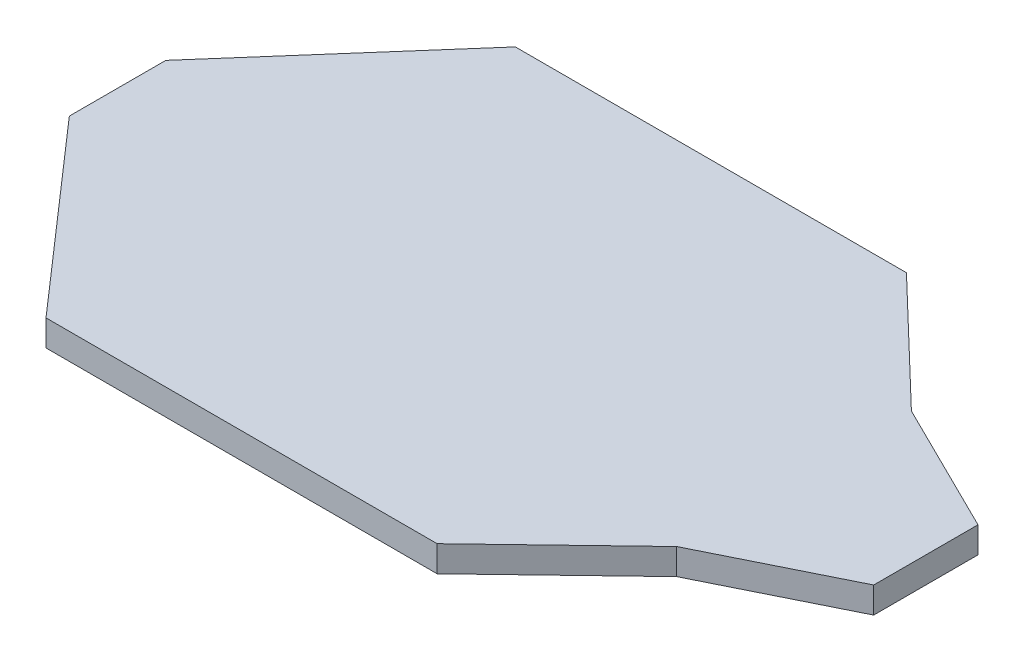
ISO-10303-21;
HEADER;
FILE_DESCRIPTION(('STEP AP214'),'2;1');
FILE_NAME('part.step','',(''),(''),'','','');
FILE_SCHEMA(('AUTOMOTIVE_DESIGN { 1 0 10303 214 1 1 1 1 }'));
ENDSEC;
DATA;
#1=APPLICATION_CONTEXT('core data for automotive mechanical design processes');
#2=APPLICATION_PROTOCOL_DEFINITION('international standard','automotive_design',2000,#1);
#3=PRODUCT_CONTEXT('',#1,'mechanical');
#4=PRODUCT('Part','Part','',(#3));
#5=PRODUCT_RELATED_PRODUCT_CATEGORY('part','',(#4));
#6=PRODUCT_DEFINITION_FORMATION('','',#4);
#7=PRODUCT_DEFINITION_CONTEXT('part definition',#1,'design');
#8=PRODUCT_DEFINITION('design','',#6,#7);
#9=PRODUCT_DEFINITION_SHAPE('','',#8);
#10=(LENGTH_UNIT() NAMED_UNIT(*) SI_UNIT(.MILLI.,.METRE.));
#11=(NAMED_UNIT(*) PLANE_ANGLE_UNIT() SI_UNIT($,.RADIAN.));
#12=(NAMED_UNIT(*) SI_UNIT($,.STERADIAN.) SOLID_ANGLE_UNIT());
#13=UNCERTAINTY_MEASURE_WITH_UNIT(LENGTH_MEASURE(1.E-05),#10,'distance_accuracy_value','');
#14=(GEOMETRIC_REPRESENTATION_CONTEXT(3) GLOBAL_UNCERTAINTY_ASSIGNED_CONTEXT((#13)) GLOBAL_UNIT_ASSIGNED_CONTEXT((#10,
#11,#12)) REPRESENTATION_CONTEXT('',''));
#15=CARTESIAN_POINT('',(0.,0.,0.));
#16=DIRECTION('',(0.,0.,1.));
#17=DIRECTION('',(1.,0.,0.));
#18=AXIS2_PLACEMENT_3D('',#15,#16,#17);
#19=CARTESIAN_POINT('',(0.,10.,18.5));
#20=DIRECTION('',(0.752631578947368,0.,-0.658441877747149));
#21=DIRECTION('',(-0.658441877747149,0.,-0.752631578947368));
#22=AXIS2_PLACEMENT_3D('',#19,#20,#21);
#23=PLANE('',#22);
#24=DIRECTION('',(0.658441877747149,0.,0.752631578947368));
#25=VECTOR('',#24,1.);
#26=CARTESIAN_POINT('',(0.,0.,18.5));
#27=LINE('',#26,#25);
#28=CARTESIAN_POINT('',(0.,0.,18.5));
#29=VERTEX_POINT('',#28);
#30=CARTESIAN_POINT('',(62.5519783859791,0.,90.));
#31=VERTEX_POINT('',#30);
#32=EDGE_CURVE('E141',#29,#31,#27,.T.);
#33=ORIENTED_EDGE('',*,*,#32,.T.);
#34=DIRECTION('',(0.,-1.,0.));
#35=VECTOR('',#34,1.);
#36=CARTESIAN_POINT('',(62.5519783859791,10.,90.));
#37=LINE('',#36,#35);
#38=CARTESIAN_POINT('',(62.5519783859791,10.,90.));
#39=VERTEX_POINT('',#38);
#40=EDGE_CURVE('E11',#39,#31,#37,.T.);
#41=ORIENTED_EDGE('',*,*,#40,.F.);
#42=DIRECTION('',(0.658441877747149,0.,0.752631578947368));
#43=VECTOR('',#42,1.);
#44=CARTESIAN_POINT('',(0.,10.,18.5));
#45=LINE('',#44,#43);
#46=CARTESIAN_POINT('',(0.,10.,18.5));
#47=VERTEX_POINT('',#46);
#48=EDGE_CURVE('E159',#47,#39,#45,.T.);
#49=ORIENTED_EDGE('',*,*,#48,.F.);
#50=DIRECTION('',(0.,-1.,0.));
#51=VECTOR('',#50,1.);
#52=CARTESIAN_POINT('',(0.,10.,18.5));
#53=LINE('',#52,#51);
#54=EDGE_CURVE('E137',#47,#29,#53,.T.);
#55=ORIENTED_EDGE('',*,*,#54,.T.);
#56=EDGE_LOOP('',(#33,#41,#49,#55));
#57=FACE_BOUND('',#56,.T.);
#58=ADVANCED_FACE('F33',(#57),#23,.F.);
#59=CARTESIAN_POINT('',(62.5519783859791,10.,90.));
#60=DIRECTION('',(0.,0.,-1.));
#61=DIRECTION('',(-1.,0.,0.));
#62=AXIS2_PLACEMENT_3D('',#59,#60,#61);
#63=PLANE('',#62);
#64=DIRECTION('',(1.,0.,0.));
#65=VECTOR('',#64,1.);
#66=CARTESIAN_POINT('',(62.5519783859791,0.,90.));
#67=LINE('',#66,#65);
#68=CARTESIAN_POINT('',(212.551978385979,0.,90.));
#69=VERTEX_POINT('',#68);
#70=EDGE_CURVE('E144',#31,#69,#67,.T.);
#71=ORIENTED_EDGE('',*,*,#70,.T.);
#72=DIRECTION('',(0.,-1.,0.));
#73=VECTOR('',#72,1.);
#74=CARTESIAN_POINT('',(212.551978385979,10.,90.));
#75=LINE('',#74,#73);
#76=CARTESIAN_POINT('',(212.551978385979,10.,90.));
#77=VERTEX_POINT('',#76);
#78=EDGE_CURVE('E41',#77,#69,#75,.T.);
#79=ORIENTED_EDGE('',*,*,#78,.F.);
#80=DIRECTION('',(1.,0.,0.));
#81=VECTOR('',#80,1.);
#82=CARTESIAN_POINT('',(62.5519783859791,10.,90.));
#83=LINE('',#82,#81);
#84=EDGE_CURVE('E98',#39,#77,#83,.T.);
#85=ORIENTED_EDGE('',*,*,#84,.F.);
#86=ORIENTED_EDGE('',*,*,#40,.T.);
#87=EDGE_LOOP('',(#71,#79,#85,#86));
#88=FACE_BOUND('',#87,.T.);
#89=ADVANCED_FACE('F208',(#88),#63,.F.);
#90=CARTESIAN_POINT('',(212.551978385979,10.,90.));
#91=DIRECTION('',(-0.692307692307692,0.,-0.72160242458822));
#92=DIRECTION('',(-0.72160242458822,0.,0.692307692307693));
#93=AXIS2_PLACEMENT_3D('',#90,#91,#92);
#94=PLANE('',#93);
#95=DIRECTION('',(0.72160242458822,0.,-0.692307692307692));
#96=VECTOR('',#95,1.);
#97=CARTESIAN_POINT('',(212.551978385979,0.,90.));
#98=LINE('',#97,#96);
#99=CARTESIAN_POINT('',(259.456135984213,0.,45.));
#100=VERTEX_POINT('',#99);
#101=EDGE_CURVE('E146',#69,#100,#98,.T.);
#102=ORIENTED_EDGE('',*,*,#101,.T.);
#103=DIRECTION('',(0.,-1.,0.));
#104=VECTOR('',#103,1.);
#105=CARTESIAN_POINT('',(259.456135984213,10.,45.));
#106=LINE('',#105,#104);
#107=CARTESIAN_POINT('',(259.456135984213,10.,45.));
#108=VERTEX_POINT('',#107);
#109=EDGE_CURVE('E172',#108,#100,#106,.T.);
#110=ORIENTED_EDGE('',*,*,#109,.F.);
#111=DIRECTION('',(0.72160242458822,0.,-0.692307692307692));
#112=VECTOR('',#111,1.);
#113=CARTESIAN_POINT('',(212.551978385979,10.,90.));
#114=LINE('',#113,#112);
#115=EDGE_CURVE('E180',#77,#108,#114,.T.);
#116=ORIENTED_EDGE('',*,*,#115,.F.);
#117=ORIENTED_EDGE('',*,*,#78,.T.);
#118=EDGE_LOOP('',(#102,#110,#116,#117));
#119=FACE_BOUND('',#118,.T.);
#120=ADVANCED_FACE('F178',(#119),#94,.F.);
#121=CARTESIAN_POINT('',(259.456135984213,10.,45.));
#122=DIRECTION('',(-0.443351468739313,0.,-0.896347853886366));
#123=DIRECTION('',(-0.896347853886366,0.,0.443351468739313));
#124=AXIS2_PLACEMENT_3D('',#121,#122,#123);
#125=PLANE('',#124);
#126=DIRECTION('',(0.896347853886366,0.,-0.443351468739313));
#127=VECTOR('',#126,1.);
#128=CARTESIAN_POINT('',(259.456135984213,0.,45.));
#129=LINE('',#128,#127);
#130=CARTESIAN_POINT('',(310.,0.,20.));
#131=VERTEX_POINT('',#130);
#132=EDGE_CURVE('E148',#100,#131,#129,.T.);
#133=ORIENTED_EDGE('',*,*,#132,.T.);
#134=DIRECTION('',(0.,-1.,0.));
#135=VECTOR('',#134,1.);
#136=CARTESIAN_POINT('',(310.,10.,20.));
#137=LINE('',#136,#135);
#138=CARTESIAN_POINT('',(310.,10.,20.));
#139=VERTEX_POINT('',#138);
#140=EDGE_CURVE('E169',#139,#131,#137,.T.);
#141=ORIENTED_EDGE('',*,*,#140,.F.);
#142=DIRECTION('',(0.896347853886366,0.,-0.443351468739313));
#143=VECTOR('',#142,1.);
#144=CARTESIAN_POINT('',(259.456135984213,10.,45.));
#145=LINE('',#144,#143);
#146=EDGE_CURVE('E198',#108,#139,#145,.T.);
#147=ORIENTED_EDGE('',*,*,#146,.F.);
#148=ORIENTED_EDGE('',*,*,#109,.T.);
#149=EDGE_LOOP('',(#133,#141,#147,#148));
#150=FACE_BOUND('',#149,.T.);
#151=ADVANCED_FACE('F189',(#150),#125,.F.);
#152=CARTESIAN_POINT('',(310.,10.,20.));
#153=DIRECTION('',(-1.,0.,0.));
#154=DIRECTION('',(0.,0.,1.));
#155=AXIS2_PLACEMENT_3D('',#152,#153,#154);
#156=PLANE('',#155);
#157=DIRECTION('',(0.,0.,-1.));
#158=VECTOR('',#157,1.);
#159=CARTESIAN_POINT('',(310.,0.,20.));
#160=LINE('',#159,#158);
#161=CARTESIAN_POINT('',(310.,0.,-20.));
#162=VERTEX_POINT('',#161);
#163=EDGE_CURVE('E150',#131,#162,#160,.T.);
#164=ORIENTED_EDGE('',*,*,#163,.T.);
#165=DIRECTION('',(0.,-1.,0.));
#166=VECTOR('',#165,1.);
#167=CARTESIAN_POINT('',(310.,10.,-20.));
#168=LINE('',#167,#166);
#169=CARTESIAN_POINT('',(310.,10.,-20.));
#170=VERTEX_POINT('',#169);
#171=EDGE_CURVE('E166',#170,#162,#168,.T.);
#172=ORIENTED_EDGE('',*,*,#171,.F.);
#173=DIRECTION('',(0.,0.,-1.));
#174=VECTOR('',#173,1.);
#175=CARTESIAN_POINT('',(310.,10.,20.));
#176=LINE('',#175,#174);
#177=EDGE_CURVE('E195',#139,#170,#176,.T.);
#178=ORIENTED_EDGE('',*,*,#177,.F.);
#179=ORIENTED_EDGE('',*,*,#140,.T.);
#180=EDGE_LOOP('',(#164,#172,#178,#179));
#181=FACE_BOUND('',#180,.T.);
#182=ADVANCED_FACE('F193',(#181),#156,.F.);
#183=CARTESIAN_POINT('',(259.456135984213,10.,-45.));
#184=DIRECTION('',(-0.443351468739314,0.,0.896347853886366));
#185=DIRECTION('',(0.896347853886366,0.,0.443351468739314));
#186=AXIS2_PLACEMENT_3D('',#183,#184,#185);
#187=PLANE('',#186);
#188=DIRECTION('',(-0.896347853886366,0.,-0.443351468739314));
#189=VECTOR('',#188,1.);
#190=CARTESIAN_POINT('',(259.456135984213,0.,-45.));
#191=LINE('',#190,#189);
#192=CARTESIAN_POINT('',(259.456135984213,0.,-45.));
#193=VERTEX_POINT('',#192);
#194=EDGE_CURVE('E152',#162,#193,#191,.T.);
#195=ORIENTED_EDGE('',*,*,#194,.T.);
#196=DIRECTION('',(0.,-1.,0.));
#197=VECTOR('',#196,1.);
#198=CARTESIAN_POINT('',(259.456135984213,10.,-45.));
#199=LINE('',#198,#197);
#200=CARTESIAN_POINT('',(259.456135984213,10.,-45.));
#201=VERTEX_POINT('',#200);
#202=EDGE_CURVE('E163',#201,#193,#199,.T.);
#203=ORIENTED_EDGE('',*,*,#202,.F.);
#204=DIRECTION('',(-0.896347853886366,0.,-0.443351468739314));
#205=VECTOR('',#204,1.);
#206=CARTESIAN_POINT('',(259.456135984213,10.,-45.));
#207=LINE('',#206,#205);
#208=EDGE_CURVE('E197',#170,#201,#207,.T.);
#209=ORIENTED_EDGE('',*,*,#208,.F.);
#210=ORIENTED_EDGE('',*,*,#171,.T.);
#211=EDGE_LOOP('',(#195,#203,#209,#210));
#212=FACE_BOUND('',#211,.T.);
#213=ADVANCED_FACE('F220',(#212),#187,.F.);
#214=CARTESIAN_POINT('',(212.551978385979,10.,-90.));
#215=DIRECTION('',(-0.692307692307692,0.,0.72160242458822));
#216=DIRECTION('',(0.72160242458822,0.,0.692307692307692));
#217=AXIS2_PLACEMENT_3D('',#214,#215,#216);
#218=PLANE('',#217);
#219=DIRECTION('',(-0.72160242458822,0.,-0.692307692307692));
#220=VECTOR('',#219,1.);
#221=CARTESIAN_POINT('',(212.551978385979,0.,-90.));
#222=LINE('',#221,#220);
#223=CARTESIAN_POINT('',(212.551978385979,0.,-90.));
#224=VERTEX_POINT('',#223);
#225=EDGE_CURVE('E154',#193,#224,#222,.T.);
#226=ORIENTED_EDGE('',*,*,#225,.T.);
#227=DIRECTION('',(0.,-1.,0.));
#228=VECTOR('',#227,1.);
#229=CARTESIAN_POINT('',(212.551978385979,10.,-90.));
#230=LINE('',#229,#228);
#231=CARTESIAN_POINT('',(212.551978385979,10.,-90.));
#232=VERTEX_POINT('',#231);
#233=EDGE_CURVE('E132',#232,#224,#230,.T.);
#234=ORIENTED_EDGE('',*,*,#233,.F.);
#235=DIRECTION('',(-0.72160242458822,0.,-0.692307692307692));
#236=VECTOR('',#235,1.);
#237=CARTESIAN_POINT('',(212.551978385979,10.,-90.));
#238=LINE('',#237,#236);
#239=EDGE_CURVE('E123',#201,#232,#238,.T.);
#240=ORIENTED_EDGE('',*,*,#239,.F.);
#241=ORIENTED_EDGE('',*,*,#202,.T.);
#242=EDGE_LOOP('',(#226,#234,#240,#241));
#243=FACE_BOUND('',#242,.T.);
#244=ADVANCED_FACE('F223',(#243),#218,.F.);
#245=CARTESIAN_POINT('',(62.5519783859791,10.,-90.));
#246=DIRECTION('',(0.,0.,1.));
#247=DIRECTION('',(1.,0.,0.));
#248=AXIS2_PLACEMENT_3D('',#245,#246,#247);
#249=PLANE('',#248);
#250=DIRECTION('',(-1.,0.,0.));
#251=VECTOR('',#250,1.);
#252=CARTESIAN_POINT('',(62.5519783859791,0.,-90.));
#253=LINE('',#252,#251);
#254=CARTESIAN_POINT('',(62.5519783859791,0.,-90.));
#255=VERTEX_POINT('',#254);
#256=EDGE_CURVE('E131',#224,#255,#253,.T.);
#257=ORIENTED_EDGE('',*,*,#256,.T.);
#258=DIRECTION('',(0.,-1.,0.));
#259=VECTOR('',#258,1.);
#260=CARTESIAN_POINT('',(62.5519783859791,10.,-90.));
#261=LINE('',#260,#259);
#262=CARTESIAN_POINT('',(62.5519783859791,10.,-90.));
#263=VERTEX_POINT('',#262);
#264=EDGE_CURVE('E128',#263,#255,#261,.T.);
#265=ORIENTED_EDGE('',*,*,#264,.F.);
#266=DIRECTION('',(-1.,0.,0.));
#267=VECTOR('',#266,1.);
#268=CARTESIAN_POINT('',(62.5519783859791,10.,-90.));
#269=LINE('',#268,#267);
#270=EDGE_CURVE('E117',#232,#263,#269,.T.);
#271=ORIENTED_EDGE('',*,*,#270,.F.);
#272=ORIENTED_EDGE('',*,*,#233,.T.);
#273=EDGE_LOOP('',(#257,#265,#271,#272));
#274=FACE_BOUND('',#273,.T.);
#275=ADVANCED_FACE('F129',(#274),#249,.F.);
#276=CARTESIAN_POINT('',(0.,10.,-18.5));
#277=DIRECTION('',(0.752631578947368,0.,0.658441877747149));
#278=DIRECTION('',(0.658441877747149,0.,-0.752631578947368));
#279=AXIS2_PLACEMENT_3D('',#276,#277,#278);
#280=PLANE('',#279);
#281=DIRECTION('',(-0.658441877747149,0.,0.752631578947368));
#282=VECTOR('',#281,1.);
#283=CARTESIAN_POINT('',(0.,0.,-18.5));
#284=LINE('',#283,#282);
#285=CARTESIAN_POINT('',(0.,0.,-18.5));
#286=VERTEX_POINT('',#285);
#287=EDGE_CURVE('E84',#255,#286,#284,.T.);
#288=ORIENTED_EDGE('',*,*,#287,.T.);
#289=DIRECTION('',(0.,-1.,0.));
#290=VECTOR('',#289,1.);
#291=CARTESIAN_POINT('',(0.,10.,-18.5));
#292=LINE('',#291,#290);
#293=CARTESIAN_POINT('',(0.,10.,-18.5));
#294=VERTEX_POINT('',#293);
#295=EDGE_CURVE('E133',#294,#286,#292,.T.);
#296=ORIENTED_EDGE('',*,*,#295,.F.);
#297=DIRECTION('',(-0.658441877747149,0.,0.752631578947368));
#298=VECTOR('',#297,1.);
#299=CARTESIAN_POINT('',(0.,10.,-18.5));
#300=LINE('',#299,#298);
#301=EDGE_CURVE('E121',#263,#294,#300,.T.);
#302=ORIENTED_EDGE('',*,*,#301,.F.);
#303=ORIENTED_EDGE('',*,*,#264,.T.);
#304=EDGE_LOOP('',(#288,#296,#302,#303));
#305=FACE_BOUND('',#304,.T.);
#306=ADVANCED_FACE('F135',(#305),#280,.F.);
#307=CARTESIAN_POINT('',(0.,10.,18.5));
#308=DIRECTION('',(1.,0.,0.));
#309=DIRECTION('',(0.,0.,-1.));
#310=AXIS2_PLACEMENT_3D('',#307,#308,#309);
#311=PLANE('',#310);
#312=DIRECTION('',(0.,0.,1.));
#313=VECTOR('',#312,1.);
#314=CARTESIAN_POINT('',(0.,0.,18.5));
#315=LINE('',#314,#313);
#316=EDGE_CURVE('E90',#286,#29,#315,.T.);
#317=ORIENTED_EDGE('',*,*,#316,.T.);
#318=ORIENTED_EDGE('',*,*,#54,.F.);
#319=DIRECTION('',(0.,0.,1.));
#320=VECTOR('',#319,1.);
#321=CARTESIAN_POINT('',(0.,10.,18.5));
#322=LINE('',#321,#320);
#323=EDGE_CURVE('E49',#294,#47,#322,.T.);
#324=ORIENTED_EDGE('',*,*,#323,.F.);
#325=ORIENTED_EDGE('',*,*,#295,.T.);
#326=EDGE_LOOP('',(#317,#318,#324,#325));
#327=FACE_BOUND('',#326,.T.);
#328=ADVANCED_FACE('F232',(#327),#311,.F.);
#329=CARTESIAN_POINT('',(0.,10.,0.));
#330=DIRECTION('',(0.,1.,0.));
#331=DIRECTION('',(0.,0.,1.));
#332=AXIS2_PLACEMENT_3D('',#329,#330,#331);
#333=PLANE('',#332);
#334=ORIENTED_EDGE('',*,*,#48,.T.);
#335=ORIENTED_EDGE('',*,*,#84,.T.);
#336=ORIENTED_EDGE('',*,*,#115,.T.);
#337=ORIENTED_EDGE('',*,*,#146,.T.);
#338=ORIENTED_EDGE('',*,*,#177,.T.);
#339=ORIENTED_EDGE('',*,*,#208,.T.);
#340=ORIENTED_EDGE('',*,*,#239,.T.);
#341=ORIENTED_EDGE('',*,*,#270,.T.);
#342=ORIENTED_EDGE('',*,*,#301,.T.);
#343=ORIENTED_EDGE('',*,*,#323,.T.);
#344=EDGE_LOOP('',(#334,#335,#336,#337,#338,#339,#340,#341,#342,#343));
#345=FACE_BOUND('',#344,.T.);
#346=ADVANCED_FACE('F119',(#345),#333,.T.);
#347=CARTESIAN_POINT('',(0.,0.,0.));
#348=DIRECTION('',(0.,1.,0.));
#349=DIRECTION('',(0.,0.,1.));
#350=AXIS2_PLACEMENT_3D('',#347,#348,#349);
#351=PLANE('',#350);
#352=ORIENTED_EDGE('',*,*,#32,.F.);
#353=ORIENTED_EDGE('',*,*,#316,.F.);
#354=ORIENTED_EDGE('',*,*,#287,.F.);
#355=ORIENTED_EDGE('',*,*,#256,.F.);
#356=ORIENTED_EDGE('',*,*,#225,.F.);
#357=ORIENTED_EDGE('',*,*,#194,.F.);
#358=ORIENTED_EDGE('',*,*,#163,.F.);
#359=ORIENTED_EDGE('',*,*,#132,.F.);
#360=ORIENTED_EDGE('',*,*,#101,.F.);
#361=ORIENTED_EDGE('',*,*,#70,.F.);
#362=EDGE_LOOP('',(#352,#353,#354,#355,#356,#357,#358,#359,#360,#361));
#363=FACE_BOUND('',#362,.T.);
#364=ADVANCED_FACE('F184',(#363),#351,.F.);
#365=CLOSED_SHELL('',(#58,#89,#120,#151,#182,#213,#244,#275,#306,#328,#346,#364));
#366=MANIFOLD_SOLID_BREP('B2',#365);
#367=ADVANCED_BREP_SHAPE_REPRESENTATION('',(#18,#366),#14);
#368=SHAPE_DEFINITION_REPRESENTATION(#9,#367);
ENDSEC;
END-ISO-10303-21;
